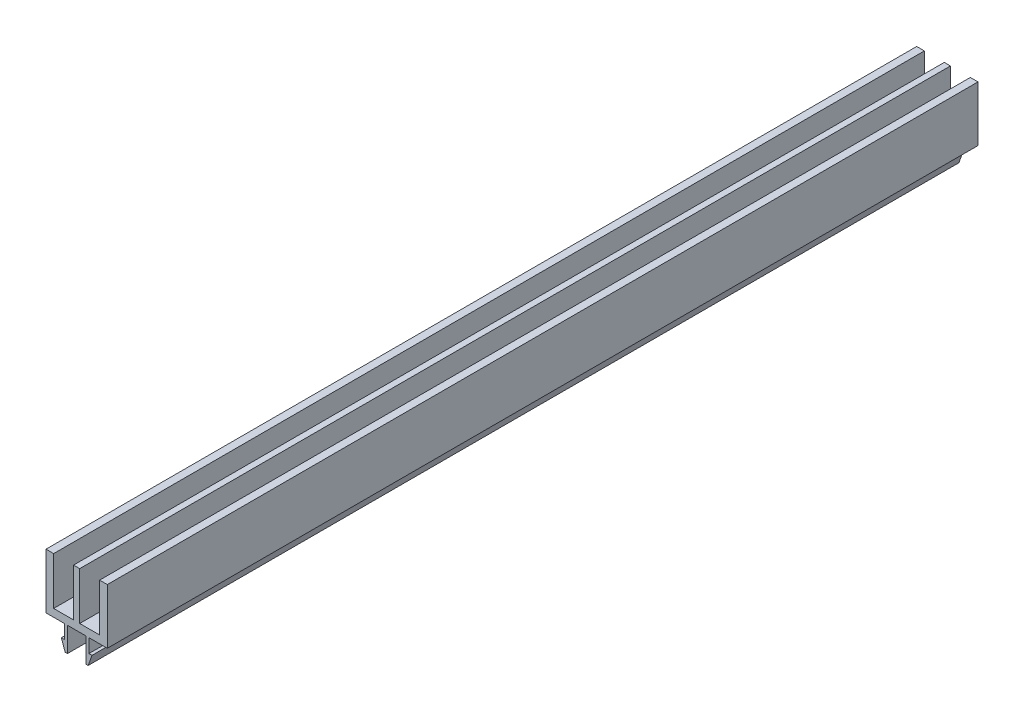
ISO-10303-21;
HEADER;
FILE_DESCRIPTION(('STEP AP214'),'2;1');
FILE_NAME('part.step','',(''),(''),'','','');
FILE_SCHEMA(('AUTOMOTIVE_DESIGN { 1 0 10303 214 1 1 1 1 }'));
ENDSEC;
DATA;
#1=APPLICATION_CONTEXT('core data for automotive mechanical design processes');
#2=APPLICATION_PROTOCOL_DEFINITION('international standard','automotive_design',2000,#1);
#3=PRODUCT_CONTEXT('',#1,'mechanical');
#4=PRODUCT('Part','Part','',(#3));
#5=PRODUCT_RELATED_PRODUCT_CATEGORY('part','',(#4));
#6=PRODUCT_DEFINITION_FORMATION('','',#4);
#7=PRODUCT_DEFINITION_CONTEXT('part definition',#1,'design');
#8=PRODUCT_DEFINITION('design','',#6,#7);
#9=PRODUCT_DEFINITION_SHAPE('','',#8);
#10=(LENGTH_UNIT() NAMED_UNIT(*) SI_UNIT(.MILLI.,.METRE.));
#11=(NAMED_UNIT(*) PLANE_ANGLE_UNIT() SI_UNIT($,.RADIAN.));
#12=(NAMED_UNIT(*) SI_UNIT($,.STERADIAN.) SOLID_ANGLE_UNIT());
#13=UNCERTAINTY_MEASURE_WITH_UNIT(LENGTH_MEASURE(1.E-05),#10,'distance_accuracy_value','');
#14=(GEOMETRIC_REPRESENTATION_CONTEXT(3) GLOBAL_UNCERTAINTY_ASSIGNED_CONTEXT((#13)) GLOBAL_UNIT_ASSIGNED_CONTEXT((#10,
#11,#12)) REPRESENTATION_CONTEXT('',''));
#15=CARTESIAN_POINT('',(0.,0.,0.));
#16=DIRECTION('',(0.,0.,1.));
#17=DIRECTION('',(1.,0.,0.));
#18=AXIS2_PLACEMENT_3D('',#15,#16,#17);
#19=CARTESIAN_POINT('',(-1.,17.9999999975,-234.));
#20=DIRECTION('',(-1.,0.,0.));
#21=DIRECTION('',(0.,-1.,0.));
#22=AXIS2_PLACEMENT_3D('',#19,#20,#21);
#23=PLANE('',#22);
#24=DIRECTION('',(0.,-1.,0.));
#25=VECTOR('',#24,1.);
#26=CARTESIAN_POINT('',(-1.,17.9999999975,50.));
#27=LINE('',#26,#25);
#28=CARTESIAN_POINT('',(-1.,17.9999999975,50.));
#29=VERTEX_POINT('',#28);
#30=CARTESIAN_POINT('',(-1.,2.4999999995,50.));
#31=VERTEX_POINT('',#30);
#32=EDGE_CURVE('E225',#29,#31,#27,.T.);
#33=ORIENTED_EDGE('',*,*,#32,.F.);
#34=DIRECTION('',(0.,0.,1.));
#35=VECTOR('',#34,1.);
#36=CARTESIAN_POINT('',(-1.,17.9999999975,-234.));
#37=LINE('',#36,#35);
#38=CARTESIAN_POINT('',(-1.,17.9999999975,-234.));
#39=VERTEX_POINT('',#38);
#40=EDGE_CURVE('E11',#39,#29,#37,.T.);
#41=ORIENTED_EDGE('',*,*,#40,.F.);
#42=DIRECTION('',(0.,-1.,0.));
#43=VECTOR('',#42,1.);
#44=CARTESIAN_POINT('',(-1.,17.9999999975,-234.));
#45=LINE('',#44,#43);
#46=CARTESIAN_POINT('',(-1.,2.4999999995,-234.));
#47=VERTEX_POINT('',#46);
#48=EDGE_CURVE('E293',#39,#47,#45,.T.);
#49=ORIENTED_EDGE('',*,*,#48,.T.);
#50=DIRECTION('',(0.,0.,1.));
#51=VECTOR('',#50,1.);
#52=CARTESIAN_POINT('',(-1.,2.4999999995,-234.));
#53=LINE('',#52,#51);
#54=EDGE_CURVE('E35',#47,#31,#53,.T.);
#55=ORIENTED_EDGE('',*,*,#54,.T.);
#56=EDGE_LOOP('',(#33,#41,#49,#55));
#57=FACE_BOUND('',#56,.T.);
#58=ADVANCED_FACE('F32',(#57),#23,.T.);
#59=CARTESIAN_POINT('',(0.999999999999998,17.9999999975,-234.));
#60=DIRECTION('',(0.,1.,0.));
#61=DIRECTION('',(0.,0.,1.));
#62=AXIS2_PLACEMENT_3D('',#59,#60,#61);
#63=PLANE('',#62);
#64=DIRECTION('',(-1.,0.,0.));
#65=VECTOR('',#64,1.);
#66=CARTESIAN_POINT('',(0.999999999999998,17.9999999975,50.));
#67=LINE('',#66,#65);
#68=CARTESIAN_POINT('',(0.999999999999998,17.9999999975,50.));
#69=VERTEX_POINT('',#68);
#70=EDGE_CURVE('E291',#69,#29,#67,.T.);
#71=ORIENTED_EDGE('',*,*,#70,.F.);
#72=DIRECTION('',(0.,0.,1.));
#73=VECTOR('',#72,1.);
#74=CARTESIAN_POINT('',(0.999999999999998,17.9999999975,-234.));
#75=LINE('',#74,#73);
#76=CARTESIAN_POINT('',(0.999999999999998,17.9999999975,-234.));
#77=VERTEX_POINT('',#76);
#78=EDGE_CURVE('E41',#77,#69,#75,.T.);
#79=ORIENTED_EDGE('',*,*,#78,.F.);
#80=DIRECTION('',(-1.,0.,0.));
#81=VECTOR('',#80,1.);
#82=CARTESIAN_POINT('',(0.999999999999998,17.9999999975,-234.));
#83=LINE('',#82,#81);
#84=EDGE_CURVE('E215',#77,#39,#83,.T.);
#85=ORIENTED_EDGE('',*,*,#84,.T.);
#86=ORIENTED_EDGE('',*,*,#40,.T.);
#87=EDGE_LOOP('',(#71,#79,#85,#86));
#88=FACE_BOUND('',#87,.T.);
#89=ADVANCED_FACE('F337',(#88),#63,.T.);
#90=CARTESIAN_POINT('',(0.999999999999998,2.4999999995,-234.));
#91=DIRECTION('',(1.,0.,0.));
#92=DIRECTION('',(0.,0.,-1.));
#93=AXIS2_PLACEMENT_3D('',#90,#91,#92);
#94=PLANE('',#93);
#95=DIRECTION('',(0.,1.,0.));
#96=VECTOR('',#95,1.);
#97=CARTESIAN_POINT('',(0.999999999999998,2.4999999995,50.));
#98=LINE('',#97,#96);
#99=CARTESIAN_POINT('',(0.999999999999998,2.4999999995,50.));
#100=VERTEX_POINT('',#99);
#101=EDGE_CURVE('E202',#100,#69,#98,.T.);
#102=ORIENTED_EDGE('',*,*,#101,.F.);
#103=DIRECTION('',(0.,0.,1.));
#104=VECTOR('',#103,1.);
#105=CARTESIAN_POINT('',(0.999999999999998,2.4999999995,-234.));
#106=LINE('',#105,#104);
#107=CARTESIAN_POINT('',(0.999999999999998,2.4999999995,-234.));
#108=VERTEX_POINT('',#107);
#109=EDGE_CURVE('E197',#108,#100,#106,.T.);
#110=ORIENTED_EDGE('',*,*,#109,.F.);
#111=DIRECTION('',(0.,1.,0.));
#112=VECTOR('',#111,1.);
#113=CARTESIAN_POINT('',(0.999999999999998,2.4999999995,-234.));
#114=LINE('',#113,#112);
#115=EDGE_CURVE('E200',#108,#77,#114,.T.);
#116=ORIENTED_EDGE('',*,*,#115,.T.);
#117=ORIENTED_EDGE('',*,*,#78,.T.);
#118=EDGE_LOOP('',(#102,#110,#116,#117));
#119=FACE_BOUND('',#118,.T.);
#120=ADVANCED_FACE('F199',(#119),#94,.T.);
#121=CARTESIAN_POINT('',(7.5,2.4999999995,-234.));
#122=DIRECTION('',(0.,1.,0.));
#123=DIRECTION('',(-1.,0.,0.));
#124=AXIS2_PLACEMENT_3D('',#121,#122,#123);
#125=PLANE('',#124);
#126=DIRECTION('',(-1.,0.,0.));
#127=VECTOR('',#126,1.);
#128=CARTESIAN_POINT('',(7.5,2.4999999995,50.));
#129=LINE('',#128,#127);
#130=CARTESIAN_POINT('',(7.5,2.4999999995,50.));
#131=VERTEX_POINT('',#130);
#132=EDGE_CURVE('E288',#131,#100,#129,.T.);
#133=ORIENTED_EDGE('',*,*,#132,.F.);
#134=DIRECTION('',(0.,0.,1.));
#135=VECTOR('',#134,1.);
#136=CARTESIAN_POINT('',(7.5,2.4999999995,-234.));
#137=LINE('',#136,#135);
#138=CARTESIAN_POINT('',(7.5,2.4999999995,-234.));
#139=VERTEX_POINT('',#138);
#140=EDGE_CURVE('E207',#139,#131,#137,.T.);
#141=ORIENTED_EDGE('',*,*,#140,.F.);
#142=DIRECTION('',(-1.,0.,0.));
#143=VECTOR('',#142,1.);
#144=CARTESIAN_POINT('',(7.5,2.4999999995,-234.));
#145=LINE('',#144,#143);
#146=EDGE_CURVE('E213',#139,#108,#145,.T.);
#147=ORIENTED_EDGE('',*,*,#146,.T.);
#148=ORIENTED_EDGE('',*,*,#109,.T.);
#149=EDGE_LOOP('',(#133,#141,#147,#148));
#150=FACE_BOUND('',#149,.T.);
#151=ADVANCED_FACE('F217',(#150),#125,.T.);
#152=CARTESIAN_POINT('',(7.5,17.9999999975,-234.));
#153=DIRECTION('',(-1.,0.,0.));
#154=DIRECTION('',(0.,-1.,0.));
#155=AXIS2_PLACEMENT_3D('',#152,#153,#154);
#156=PLANE('',#155);
#157=DIRECTION('',(0.,-1.,0.));
#158=VECTOR('',#157,1.);
#159=CARTESIAN_POINT('',(7.5,17.9999999975,50.));
#160=LINE('',#159,#158);
#161=CARTESIAN_POINT('',(7.5,17.9999999975,50.));
#162=VERTEX_POINT('',#161);
#163=EDGE_CURVE('E285',#162,#131,#160,.T.);
#164=ORIENTED_EDGE('',*,*,#163,.F.);
#165=DIRECTION('',(0.,0.,1.));
#166=VECTOR('',#165,1.);
#167=CARTESIAN_POINT('',(7.5,17.9999999975,-234.));
#168=LINE('',#167,#166);
#169=CARTESIAN_POINT('',(7.5,17.9999999975,-234.));
#170=VERTEX_POINT('',#169);
#171=EDGE_CURVE('E297',#170,#162,#168,.T.);
#172=ORIENTED_EDGE('',*,*,#171,.F.);
#173=DIRECTION('',(0.,-1.,0.));
#174=VECTOR('',#173,1.);
#175=CARTESIAN_POINT('',(7.5,17.9999999975,-234.));
#176=LINE('',#175,#174);
#177=EDGE_CURVE('E218',#170,#139,#176,.T.);
#178=ORIENTED_EDGE('',*,*,#177,.T.);
#179=ORIENTED_EDGE('',*,*,#140,.T.);
#180=EDGE_LOOP('',(#164,#172,#178,#179));
#181=FACE_BOUND('',#180,.T.);
#182=ADVANCED_FACE('F350',(#181),#156,.T.);
#183=CARTESIAN_POINT('',(10.,17.9999999975,-234.));
#184=DIRECTION('',(0.,1.,0.));
#185=DIRECTION('',(0.,0.,1.));
#186=AXIS2_PLACEMENT_3D('',#183,#184,#185);
#187=PLANE('',#186);
#188=DIRECTION('',(-1.,0.,0.));
#189=VECTOR('',#188,1.);
#190=CARTESIAN_POINT('',(10.,17.9999999975,50.));
#191=LINE('',#190,#189);
#192=CARTESIAN_POINT('',(10.,17.9999999975,50.));
#193=VERTEX_POINT('',#192);
#194=EDGE_CURVE('E282',#193,#162,#191,.T.);
#195=ORIENTED_EDGE('',*,*,#194,.F.);
#196=DIRECTION('',(0.,0.,1.));
#197=VECTOR('',#196,1.);
#198=CARTESIAN_POINT('',(10.,17.9999999975,-234.));
#199=LINE('',#198,#197);
#200=CARTESIAN_POINT('',(10.,17.9999999975,-234.));
#201=VERTEX_POINT('',#200);
#202=EDGE_CURVE('E299',#201,#193,#199,.T.);
#203=ORIENTED_EDGE('',*,*,#202,.F.);
#204=DIRECTION('',(-1.,0.,0.));
#205=VECTOR('',#204,1.);
#206=CARTESIAN_POINT('',(10.,17.9999999975,-234.));
#207=LINE('',#206,#205);
#208=EDGE_CURVE('E220',#201,#170,#207,.T.);
#209=ORIENTED_EDGE('',*,*,#208,.T.);
#210=ORIENTED_EDGE('',*,*,#171,.T.);
#211=EDGE_LOOP('',(#195,#203,#209,#210));
#212=FACE_BOUND('',#211,.T.);
#213=ADVANCED_FACE('F353',(#212),#187,.T.);
#214=CARTESIAN_POINT('',(10.,-4.99999828349541E-10,-234.));
#215=DIRECTION('',(1.,0.,0.));
#216=DIRECTION('',(0.,0.,-1.));
#217=AXIS2_PLACEMENT_3D('',#214,#215,#216);
#218=PLANE('',#217);
#219=DIRECTION('',(0.,1.,0.));
#220=VECTOR('',#219,1.);
#221=CARTESIAN_POINT('',(10.,-4.99999828349541E-10,50.));
#222=LINE('',#221,#220);
#223=CARTESIAN_POINT('',(10.,-4.99999828349541E-10,50.));
#224=VERTEX_POINT('',#223);
#225=EDGE_CURVE('E279',#224,#193,#222,.T.);
#226=ORIENTED_EDGE('',*,*,#225,.F.);
#227=DIRECTION('',(0.,0.,1.));
#228=VECTOR('',#227,1.);
#229=CARTESIAN_POINT('',(10.,-4.99999828349541E-10,-234.));
#230=LINE('',#229,#228);
#231=CARTESIAN_POINT('',(10.,-4.99999828349541E-10,-234.));
#232=VERTEX_POINT('',#231);
#233=EDGE_CURVE('E301',#232,#224,#230,.T.);
#234=ORIENTED_EDGE('',*,*,#233,.F.);
#235=DIRECTION('',(0.,1.,0.));
#236=VECTOR('',#235,1.);
#237=CARTESIAN_POINT('',(10.,-4.99999828349541E-10,-234.));
#238=LINE('',#237,#236);
#239=EDGE_CURVE('E643',#232,#201,#238,.T.);
#240=ORIENTED_EDGE('',*,*,#239,.T.);
#241=ORIENTED_EDGE('',*,*,#202,.T.);
#242=EDGE_LOOP('',(#226,#234,#240,#241));
#243=FACE_BOUND('',#242,.T.);
#244=ADVANCED_FACE('F357',(#243),#218,.T.);
#245=CARTESIAN_POINT('',(4.,-4.99999998002099E-10,-234.));
#246=DIRECTION('',(0.,-1.,0.));
#247=DIRECTION('',(1.,0.,0.));
#248=AXIS2_PLACEMENT_3D('',#245,#246,#247);
#249=PLANE('',#248);
#250=DIRECTION('',(1.,0.,0.));
#251=VECTOR('',#250,1.);
#252=CARTESIAN_POINT('',(4.,-4.99999998002099E-10,50.));
#253=LINE('',#252,#251);
#254=CARTESIAN_POINT('',(4.,-4.99999998002099E-10,50.));
#255=VERTEX_POINT('',#254);
#256=EDGE_CURVE('E276',#255,#224,#253,.T.);
#257=ORIENTED_EDGE('',*,*,#256,.F.);
#258=DIRECTION('',(0.,0.,1.));
#259=VECTOR('',#258,1.);
#260=CARTESIAN_POINT('',(4.,-4.99999998002099E-10,-234.));
#261=LINE('',#260,#259);
#262=CARTESIAN_POINT('',(4.,-4.99999998002099E-10,-234.));
#263=VERTEX_POINT('',#262);
#264=EDGE_CURVE('E303',#263,#255,#261,.T.);
#265=ORIENTED_EDGE('',*,*,#264,.F.);
#266=DIRECTION('',(1.,0.,0.));
#267=VECTOR('',#266,1.);
#268=CARTESIAN_POINT('',(4.,-4.99999998002099E-10,-234.));
#269=LINE('',#268,#267);
#270=EDGE_CURVE('E647',#263,#232,#269,.T.);
#271=ORIENTED_EDGE('',*,*,#270,.T.);
#272=ORIENTED_EDGE('',*,*,#233,.T.);
#273=EDGE_LOOP('',(#257,#265,#271,#272));
#274=FACE_BOUND('',#273,.T.);
#275=ADVANCED_FACE('F361',(#274),#249,.T.);
#276=CARTESIAN_POINT('',(4.,-4.5,-234.));
#277=DIRECTION('',(1.,0.,0.));
#278=DIRECTION('',(0.,0.,-1.));
#279=AXIS2_PLACEMENT_3D('',#276,#277,#278);
#280=PLANE('',#279);
#281=DIRECTION('',(0.,1.,0.));
#282=VECTOR('',#281,1.);
#283=CARTESIAN_POINT('',(4.,-4.5,50.));
#284=LINE('',#283,#282);
#285=CARTESIAN_POINT('',(4.,-4.5,50.));
#286=VERTEX_POINT('',#285);
#287=EDGE_CURVE('E273',#286,#255,#284,.T.);
#288=ORIENTED_EDGE('',*,*,#287,.F.);
#289=DIRECTION('',(0.,0.,1.));
#290=VECTOR('',#289,1.);
#291=CARTESIAN_POINT('',(4.,-4.5,-234.));
#292=LINE('',#291,#290);
#293=CARTESIAN_POINT('',(4.,-4.5,-234.));
#294=VERTEX_POINT('',#293);
#295=EDGE_CURVE('E305',#294,#286,#292,.T.);
#296=ORIENTED_EDGE('',*,*,#295,.F.);
#297=DIRECTION('',(0.,1.,0.));
#298=VECTOR('',#297,1.);
#299=CARTESIAN_POINT('',(4.,-4.5,-234.));
#300=LINE('',#299,#298);
#301=EDGE_CURVE('E636',#294,#263,#300,.T.);
#302=ORIENTED_EDGE('',*,*,#301,.T.);
#303=ORIENTED_EDGE('',*,*,#264,.T.);
#304=EDGE_LOOP('',(#288,#296,#302,#303));
#305=FACE_BOUND('',#304,.T.);
#306=ADVANCED_FACE('F365',(#305),#280,.T.);
#307=CARTESIAN_POINT('',(5.,-4.5,-234.));
#308=DIRECTION('',(0.,1.,0.));
#309=DIRECTION('',(0.,0.,1.));
#310=AXIS2_PLACEMENT_3D('',#307,#308,#309);
#311=PLANE('',#310);
#312=DIRECTION('',(-1.,0.,0.));
#313=VECTOR('',#312,1.);
#314=CARTESIAN_POINT('',(5.,-4.5,50.));
#315=LINE('',#314,#313);
#316=CARTESIAN_POINT('',(5.,-4.5,50.));
#317=VERTEX_POINT('',#316);
#318=EDGE_CURVE('E270',#317,#286,#315,.T.);
#319=ORIENTED_EDGE('',*,*,#318,.F.);
#320=DIRECTION('',(0.,0.,1.));
#321=VECTOR('',#320,1.);
#322=CARTESIAN_POINT('',(5.,-4.5,-234.));
#323=LINE('',#322,#321);
#324=CARTESIAN_POINT('',(5.,-4.5,-234.));
#325=VERTEX_POINT('',#324);
#326=EDGE_CURVE('E307',#325,#317,#323,.T.);
#327=ORIENTED_EDGE('',*,*,#326,.F.);
#328=DIRECTION('',(-1.,0.,0.));
#329=VECTOR('',#328,1.);
#330=CARTESIAN_POINT('',(5.,-4.5,-234.));
#331=LINE('',#330,#329);
#332=EDGE_CURVE('E632',#325,#294,#331,.T.);
#333=ORIENTED_EDGE('',*,*,#332,.T.);
#334=ORIENTED_EDGE('',*,*,#295,.T.);
#335=EDGE_LOOP('',(#319,#327,#333,#334));
#336=FACE_BOUND('',#335,.T.);
#337=ADVANCED_FACE('F369',(#336),#311,.T.);
#338=CARTESIAN_POINT('',(3.75,-8.,-234.));
#339=DIRECTION('',(0.941741911594837,-0.336336396998156,0.));
#340=DIRECTION('',(0.336336396998157,0.941741911594838,0.));
#341=AXIS2_PLACEMENT_3D('',#338,#339,#340);
#342=PLANE('',#341);
#343=DIRECTION('',(0.336336396998157,0.941741911594837,0.));
#344=VECTOR('',#343,1.);
#345=CARTESIAN_POINT('',(3.75,-8.,50.));
#346=LINE('',#345,#344);
#347=CARTESIAN_POINT('',(3.75,-8.,50.));
#348=VERTEX_POINT('',#347);
#349=EDGE_CURVE('E267',#348,#317,#346,.T.);
#350=ORIENTED_EDGE('',*,*,#349,.F.);
#351=DIRECTION('',(0.,0.,1.));
#352=VECTOR('',#351,1.);
#353=CARTESIAN_POINT('',(3.75,-8.,-234.));
#354=LINE('',#353,#352);
#355=CARTESIAN_POINT('',(3.75,-8.,-234.));
#356=VERTEX_POINT('',#355);
#357=EDGE_CURVE('E309',#356,#348,#354,.T.);
#358=ORIENTED_EDGE('',*,*,#357,.F.);
#359=DIRECTION('',(0.336336396998157,0.941741911594837,0.));
#360=VECTOR('',#359,1.);
#361=CARTESIAN_POINT('',(3.75,-8.,-234.));
#362=LINE('',#361,#360);
#363=EDGE_CURVE('E653',#356,#325,#362,.T.);
#364=ORIENTED_EDGE('',*,*,#363,.T.);
#365=ORIENTED_EDGE('',*,*,#326,.T.);
#366=EDGE_LOOP('',(#350,#358,#364,#365));
#367=FACE_BOUND('',#366,.T.);
#368=ADVANCED_FACE('F373',(#367),#342,.T.);
#369=CARTESIAN_POINT('',(3.,-8.,-234.));
#370=DIRECTION('',(0.,-1.,0.));
#371=DIRECTION('',(0.,0.,-1.));
#372=AXIS2_PLACEMENT_3D('',#369,#370,#371);
#373=PLANE('',#372);
#374=DIRECTION('',(1.,0.,0.));
#375=VECTOR('',#374,1.);
#376=CARTESIAN_POINT('',(3.,-8.,50.));
#377=LINE('',#376,#375);
#378=CARTESIAN_POINT('',(3.,-8.,50.));
#379=VERTEX_POINT('',#378);
#380=EDGE_CURVE('E264',#379,#348,#377,.T.);
#381=ORIENTED_EDGE('',*,*,#380,.F.);
#382=DIRECTION('',(0.,0.,1.));
#383=VECTOR('',#382,1.);
#384=CARTESIAN_POINT('',(3.,-8.,-234.));
#385=LINE('',#384,#383);
#386=CARTESIAN_POINT('',(3.,-8.,-234.));
#387=VERTEX_POINT('',#386);
#388=EDGE_CURVE('E311',#387,#379,#385,.T.);
#389=ORIENTED_EDGE('',*,*,#388,.F.);
#390=DIRECTION('',(1.,0.,0.));
#391=VECTOR('',#390,1.);
#392=CARTESIAN_POINT('',(3.,-8.,-234.));
#393=LINE('',#392,#391);
#394=EDGE_CURVE('E625',#387,#356,#393,.T.);
#395=ORIENTED_EDGE('',*,*,#394,.T.);
#396=ORIENTED_EDGE('',*,*,#357,.T.);
#397=EDGE_LOOP('',(#381,#389,#395,#396));
#398=FACE_BOUND('',#397,.T.);
#399=ADVANCED_FACE('F377',(#398),#373,.T.);
#400=CARTESIAN_POINT('',(3.,-4.9999985194348E-10,-234.));
#401=DIRECTION('',(-1.,0.,0.));
#402=DIRECTION('',(0.,0.,1.));
#403=AXIS2_PLACEMENT_3D('',#400,#401,#402);
#404=PLANE('',#403);
#405=DIRECTION('',(0.,-1.,0.));
#406=VECTOR('',#405,1.);
#407=CARTESIAN_POINT('',(3.,-4.9999985194348E-10,50.));
#408=LINE('',#407,#406);
#409=CARTESIAN_POINT('',(3.,-4.9999985194348E-10,50.));
#410=VERTEX_POINT('',#409);
#411=EDGE_CURVE('E261',#410,#379,#408,.T.);
#412=ORIENTED_EDGE('',*,*,#411,.F.);
#413=DIRECTION('',(0.,0.,1.));
#414=VECTOR('',#413,1.);
#415=CARTESIAN_POINT('',(3.,-4.9999985194348E-10,-234.));
#416=LINE('',#415,#414);
#417=CARTESIAN_POINT('',(3.,-4.9999985194348E-10,-234.));
#418=VERTEX_POINT('',#417);
#419=EDGE_CURVE('E313',#418,#410,#416,.T.);
#420=ORIENTED_EDGE('',*,*,#419,.F.);
#421=DIRECTION('',(0.,-1.,0.));
#422=VECTOR('',#421,1.);
#423=CARTESIAN_POINT('',(3.,-4.9999985194348E-10,-234.));
#424=LINE('',#423,#422);
#425=EDGE_CURVE('E621',#418,#387,#424,.T.);
#426=ORIENTED_EDGE('',*,*,#425,.T.);
#427=ORIENTED_EDGE('',*,*,#388,.T.);
#428=EDGE_LOOP('',(#412,#420,#426,#427));
#429=FACE_BOUND('',#428,.T.);
#430=ADVANCED_FACE('F381',(#429),#404,.T.);
#431=CARTESIAN_POINT('',(-3.,-4.99999455901012E-10,-234.));
#432=DIRECTION('',(0.,-1.,0.));
#433=DIRECTION('',(1.,0.,0.));
#434=AXIS2_PLACEMENT_3D('',#431,#432,#433);
#435=PLANE('',#434);
#436=DIRECTION('',(1.,0.,0.));
#437=VECTOR('',#436,1.);
#438=CARTESIAN_POINT('',(-3.,-4.99999455901012E-10,50.));
#439=LINE('',#438,#437);
#440=CARTESIAN_POINT('',(-3.,-4.99999455901012E-10,50.));
#441=VERTEX_POINT('',#440);
#442=EDGE_CURVE('E258',#441,#410,#439,.T.);
#443=ORIENTED_EDGE('',*,*,#442,.F.);
#444=DIRECTION('',(0.,0.,1.));
#445=VECTOR('',#444,1.);
#446=CARTESIAN_POINT('',(-3.,-4.99999455901012E-10,-234.));
#447=LINE('',#446,#445);
#448=CARTESIAN_POINT('',(-3.,-4.99999455901012E-10,-234.));
#449=VERTEX_POINT('',#448);
#450=EDGE_CURVE('E315',#449,#441,#447,.T.);
#451=ORIENTED_EDGE('',*,*,#450,.F.);
#452=DIRECTION('',(1.,0.,0.));
#453=VECTOR('',#452,1.);
#454=CARTESIAN_POINT('',(-3.,-4.99999455901012E-10,-234.));
#455=LINE('',#454,#453);
#456=EDGE_CURVE('E657',#449,#418,#455,.T.);
#457=ORIENTED_EDGE('',*,*,#456,.T.);
#458=ORIENTED_EDGE('',*,*,#419,.T.);
#459=EDGE_LOOP('',(#443,#451,#457,#458));
#460=FACE_BOUND('',#459,.T.);
#461=ADVANCED_FACE('F385',(#460),#435,.T.);
#462=CARTESIAN_POINT('',(-3.,-8.,-234.));
#463=DIRECTION('',(1.,0.,0.));
#464=DIRECTION('',(0.,0.,-1.));
#465=AXIS2_PLACEMENT_3D('',#462,#463,#464);
#466=PLANE('',#465);
#467=DIRECTION('',(0.,1.,0.));
#468=VECTOR('',#467,1.);
#469=CARTESIAN_POINT('',(-3.,-8.,50.));
#470=LINE('',#469,#468);
#471=CARTESIAN_POINT('',(-3.,-8.,50.));
#472=VERTEX_POINT('',#471);
#473=EDGE_CURVE('E255',#472,#441,#470,.T.);
#474=ORIENTED_EDGE('',*,*,#473,.F.);
#475=DIRECTION('',(0.,0.,1.));
#476=VECTOR('',#475,1.);
#477=CARTESIAN_POINT('',(-3.,-8.,-234.));
#478=LINE('',#477,#476);
#479=CARTESIAN_POINT('',(-3.,-8.,-234.));
#480=VERTEX_POINT('',#479);
#481=EDGE_CURVE('E317',#480,#472,#478,.T.);
#482=ORIENTED_EDGE('',*,*,#481,.F.);
#483=DIRECTION('',(0.,1.,0.));
#484=VECTOR('',#483,1.);
#485=CARTESIAN_POINT('',(-3.,-8.,-234.));
#486=LINE('',#485,#484);
#487=EDGE_CURVE('E614',#480,#449,#486,.T.);
#488=ORIENTED_EDGE('',*,*,#487,.T.);
#489=ORIENTED_EDGE('',*,*,#450,.T.);
#490=EDGE_LOOP('',(#474,#482,#488,#489));
#491=FACE_BOUND('',#490,.T.);
#492=ADVANCED_FACE('F389',(#491),#466,.T.);
#493=CARTESIAN_POINT('',(-3.75,-8.,-234.));
#494=DIRECTION('',(0.,-1.,0.));
#495=DIRECTION('',(0.,0.,-1.));
#496=AXIS2_PLACEMENT_3D('',#493,#494,#495);
#497=PLANE('',#496);
#498=DIRECTION('',(1.,0.,0.));
#499=VECTOR('',#498,1.);
#500=CARTESIAN_POINT('',(-3.75,-8.,50.));
#501=LINE('',#500,#499);
#502=CARTESIAN_POINT('',(-3.75,-8.,50.));
#503=VERTEX_POINT('',#502);
#504=EDGE_CURVE('E252',#503,#472,#501,.T.);
#505=ORIENTED_EDGE('',*,*,#504,.F.);
#506=DIRECTION('',(0.,0.,1.));
#507=VECTOR('',#506,1.);
#508=CARTESIAN_POINT('',(-3.75,-8.,-234.));
#509=LINE('',#508,#507);
#510=CARTESIAN_POINT('',(-3.75,-8.,-234.));
#511=VERTEX_POINT('',#510);
#512=EDGE_CURVE('E319',#511,#503,#509,.T.);
#513=ORIENTED_EDGE('',*,*,#512,.F.);
#514=DIRECTION('',(1.,0.,0.));
#515=VECTOR('',#514,1.);
#516=CARTESIAN_POINT('',(-3.75,-8.,-234.));
#517=LINE('',#516,#515);
#518=EDGE_CURVE('E610',#511,#480,#517,.T.);
#519=ORIENTED_EDGE('',*,*,#518,.T.);
#520=ORIENTED_EDGE('',*,*,#481,.T.);
#521=EDGE_LOOP('',(#505,#513,#519,#520));
#522=FACE_BOUND('',#521,.T.);
#523=ADVANCED_FACE('F393',(#522),#497,.T.);
#524=CARTESIAN_POINT('',(-5.,-4.5,-234.));
#525=DIRECTION('',(-0.941741911594838,-0.336336396998156,0.));
#526=DIRECTION('',(0.336336396998156,-0.941741911594838,0.));
#527=AXIS2_PLACEMENT_3D('',#524,#525,#526);
#528=PLANE('',#527);
#529=DIRECTION('',(0.336336396998156,-0.941741911594837,0.));
#530=VECTOR('',#529,1.);
#531=CARTESIAN_POINT('',(-5.,-4.5,50.));
#532=LINE('',#531,#530);
#533=CARTESIAN_POINT('',(-5.,-4.5,50.));
#534=VERTEX_POINT('',#533);
#535=EDGE_CURVE('E249',#534,#503,#532,.T.);
#536=ORIENTED_EDGE('',*,*,#535,.F.);
#537=DIRECTION('',(0.,0.,1.));
#538=VECTOR('',#537,1.);
#539=CARTESIAN_POINT('',(-5.,-4.5,-234.));
#540=LINE('',#539,#538);
#541=CARTESIAN_POINT('',(-5.,-4.5,-234.));
#542=VERTEX_POINT('',#541);
#543=EDGE_CURVE('E321',#542,#534,#540,.T.);
#544=ORIENTED_EDGE('',*,*,#543,.F.);
#545=DIRECTION('',(0.336336396998156,-0.941741911594837,0.));
#546=VECTOR('',#545,1.);
#547=CARTESIAN_POINT('',(-5.,-4.5,-234.));
#548=LINE('',#547,#546);
#549=EDGE_CURVE('E661',#542,#511,#548,.T.);
#550=ORIENTED_EDGE('',*,*,#549,.T.);
#551=ORIENTED_EDGE('',*,*,#512,.T.);
#552=EDGE_LOOP('',(#536,#544,#550,#551));
#553=FACE_BOUND('',#552,.T.);
#554=ADVANCED_FACE('F397',(#553),#528,.T.);
#555=CARTESIAN_POINT('',(-4.,-4.5,-234.));
#556=DIRECTION('',(0.,1.,0.));
#557=DIRECTION('',(0.,0.,1.));
#558=AXIS2_PLACEMENT_3D('',#555,#556,#557);
#559=PLANE('',#558);
#560=DIRECTION('',(-1.,0.,0.));
#561=VECTOR('',#560,1.);
#562=CARTESIAN_POINT('',(-4.,-4.5,50.));
#563=LINE('',#562,#561);
#564=CARTESIAN_POINT('',(-4.,-4.5,50.));
#565=VERTEX_POINT('',#564);
#566=EDGE_CURVE('E246',#565,#534,#563,.T.);
#567=ORIENTED_EDGE('',*,*,#566,.F.);
#568=DIRECTION('',(0.,0.,1.));
#569=VECTOR('',#568,1.);
#570=CARTESIAN_POINT('',(-4.,-4.5,-234.));
#571=LINE('',#570,#569);
#572=CARTESIAN_POINT('',(-4.,-4.5,-234.));
#573=VERTEX_POINT('',#572);
#574=EDGE_CURVE('E323',#573,#565,#571,.T.);
#575=ORIENTED_EDGE('',*,*,#574,.F.);
#576=DIRECTION('',(-1.,0.,0.));
#577=VECTOR('',#576,1.);
#578=CARTESIAN_POINT('',(-4.,-4.5,-234.));
#579=LINE('',#578,#577);
#580=EDGE_CURVE('E603',#573,#542,#579,.T.);
#581=ORIENTED_EDGE('',*,*,#580,.T.);
#582=ORIENTED_EDGE('',*,*,#543,.T.);
#583=EDGE_LOOP('',(#567,#575,#581,#582));
#584=FACE_BOUND('',#583,.T.);
#585=ADVANCED_FACE('F401',(#584),#559,.T.);
#586=CARTESIAN_POINT('',(-4.,-4.9999985194348E-10,-234.));
#587=DIRECTION('',(-1.,0.,0.));
#588=DIRECTION('',(0.,0.,1.));
#589=AXIS2_PLACEMENT_3D('',#586,#587,#588);
#590=PLANE('',#589);
#591=DIRECTION('',(0.,-1.,0.));
#592=VECTOR('',#591,1.);
#593=CARTESIAN_POINT('',(-4.,-4.9999985194348E-10,50.));
#594=LINE('',#593,#592);
#595=CARTESIAN_POINT('',(-4.,-4.9999985194348E-10,50.));
#596=VERTEX_POINT('',#595);
#597=EDGE_CURVE('E243',#596,#565,#594,.T.);
#598=ORIENTED_EDGE('',*,*,#597,.F.);
#599=DIRECTION('',(0.,0.,1.));
#600=VECTOR('',#599,1.);
#601=CARTESIAN_POINT('',(-4.,-4.9999985194348E-10,-234.));
#602=LINE('',#601,#600);
#603=CARTESIAN_POINT('',(-4.,-4.9999985194348E-10,-234.));
#604=VERTEX_POINT('',#603);
#605=EDGE_CURVE('E325',#604,#596,#602,.T.);
#606=ORIENTED_EDGE('',*,*,#605,.F.);
#607=DIRECTION('',(0.,-1.,0.));
#608=VECTOR('',#607,1.);
#609=CARTESIAN_POINT('',(-4.,-4.9999985194348E-10,-234.));
#610=LINE('',#609,#608);
#611=EDGE_CURVE('E599',#604,#573,#610,.T.);
#612=ORIENTED_EDGE('',*,*,#611,.T.);
#613=ORIENTED_EDGE('',*,*,#574,.T.);
#614=EDGE_LOOP('',(#598,#606,#612,#613));
#615=FACE_BOUND('',#614,.T.);
#616=ADVANCED_FACE('F405',(#615),#590,.T.);
#617=CARTESIAN_POINT('',(-10.,-4.99999719929324E-10,-234.));
#618=DIRECTION('',(0.,-1.,0.));
#619=DIRECTION('',(1.,0.,0.));
#620=AXIS2_PLACEMENT_3D('',#617,#618,#619);
#621=PLANE('',#620);
#622=DIRECTION('',(1.,0.,0.));
#623=VECTOR('',#622,1.);
#624=CARTESIAN_POINT('',(-10.,-4.99999719929324E-10,50.));
#625=LINE('',#624,#623);
#626=CARTESIAN_POINT('',(-10.,-4.99999719929324E-10,50.));
#627=VERTEX_POINT('',#626);
#628=EDGE_CURVE('E240',#627,#596,#625,.T.);
#629=ORIENTED_EDGE('',*,*,#628,.F.);
#630=DIRECTION('',(0.,0.,1.));
#631=VECTOR('',#630,1.);
#632=CARTESIAN_POINT('',(-10.,-4.99999719929324E-10,-234.));
#633=LINE('',#632,#631);
#634=CARTESIAN_POINT('',(-10.,-4.99999719929324E-10,-234.));
#635=VERTEX_POINT('',#634);
#636=EDGE_CURVE('E327',#635,#627,#633,.T.);
#637=ORIENTED_EDGE('',*,*,#636,.F.);
#638=DIRECTION('',(1.,0.,0.));
#639=VECTOR('',#638,1.);
#640=CARTESIAN_POINT('',(-10.,-4.99999719929324E-10,-234.));
#641=LINE('',#640,#639);
#642=EDGE_CURVE('E665',#635,#604,#641,.T.);
#643=ORIENTED_EDGE('',*,*,#642,.T.);
#644=ORIENTED_EDGE('',*,*,#605,.T.);
#645=EDGE_LOOP('',(#629,#637,#643,#644));
#646=FACE_BOUND('',#645,.T.);
#647=ADVANCED_FACE('F409',(#646),#621,.T.);
#648=CARTESIAN_POINT('',(-10.,17.9999999975,-234.));
#649=DIRECTION('',(-1.,0.,0.));
#650=DIRECTION('',(0.,-1.,0.));
#651=AXIS2_PLACEMENT_3D('',#648,#649,#650);
#652=PLANE('',#651);
#653=DIRECTION('',(0.,-1.,0.));
#654=VECTOR('',#653,1.);
#655=CARTESIAN_POINT('',(-10.,17.9999999975,50.));
#656=LINE('',#655,#654);
#657=CARTESIAN_POINT('',(-10.,17.9999999975,50.));
#658=VERTEX_POINT('',#657);
#659=EDGE_CURVE('E237',#658,#627,#656,.T.);
#660=ORIENTED_EDGE('',*,*,#659,.F.);
#661=DIRECTION('',(0.,0.,1.));
#662=VECTOR('',#661,1.);
#663=CARTESIAN_POINT('',(-10.,17.9999999975,-234.));
#664=LINE('',#663,#662);
#665=CARTESIAN_POINT('',(-10.,17.9999999975,-234.));
#666=VERTEX_POINT('',#665);
#667=EDGE_CURVE('E329',#666,#658,#664,.T.);
#668=ORIENTED_EDGE('',*,*,#667,.F.);
#669=DIRECTION('',(0.,-1.,0.));
#670=VECTOR('',#669,1.);
#671=CARTESIAN_POINT('',(-10.,17.9999999975,-234.));
#672=LINE('',#671,#670);
#673=EDGE_CURVE('E592',#666,#635,#672,.T.);
#674=ORIENTED_EDGE('',*,*,#673,.T.);
#675=ORIENTED_EDGE('',*,*,#636,.T.);
#676=EDGE_LOOP('',(#660,#668,#674,#675));
#677=FACE_BOUND('',#676,.T.);
#678=ADVANCED_FACE('F413',(#677),#652,.T.);
#679=CARTESIAN_POINT('',(-7.5,17.9999999975,-234.));
#680=DIRECTION('',(0.,1.,0.));
#681=DIRECTION('',(0.,0.,1.));
#682=AXIS2_PLACEMENT_3D('',#679,#680,#681);
#683=PLANE('',#682);
#684=DIRECTION('',(-1.,0.,0.));
#685=VECTOR('',#684,1.);
#686=CARTESIAN_POINT('',(-7.5,17.9999999975,50.));
#687=LINE('',#686,#685);
#688=CARTESIAN_POINT('',(-7.5,17.9999999975,50.));
#689=VERTEX_POINT('',#688);
#690=EDGE_CURVE('E234',#689,#658,#687,.T.);
#691=ORIENTED_EDGE('',*,*,#690,.F.);
#692=DIRECTION('',(0.,0.,1.));
#693=VECTOR('',#692,1.);
#694=CARTESIAN_POINT('',(-7.5,17.9999999975,-234.));
#695=LINE('',#694,#693);
#696=CARTESIAN_POINT('',(-7.5,17.9999999975,-234.));
#697=VERTEX_POINT('',#696);
#698=EDGE_CURVE('E331',#697,#689,#695,.T.);
#699=ORIENTED_EDGE('',*,*,#698,.F.);
#700=DIRECTION('',(-1.,0.,0.));
#701=VECTOR('',#700,1.);
#702=CARTESIAN_POINT('',(-7.5,17.9999999975,-234.));
#703=LINE('',#702,#701);
#704=EDGE_CURVE('E588',#697,#666,#703,.T.);
#705=ORIENTED_EDGE('',*,*,#704,.T.);
#706=ORIENTED_EDGE('',*,*,#667,.T.);
#707=EDGE_LOOP('',(#691,#699,#705,#706));
#708=FACE_BOUND('',#707,.T.);
#709=ADVANCED_FACE('F417',(#708),#683,.T.);
#710=CARTESIAN_POINT('',(-7.5,2.4999999995,-234.));
#711=DIRECTION('',(1.,0.,0.));
#712=DIRECTION('',(0.,0.,-1.));
#713=AXIS2_PLACEMENT_3D('',#710,#711,#712);
#714=PLANE('',#713);
#715=DIRECTION('',(0.,1.,0.));
#716=VECTOR('',#715,1.);
#717=CARTESIAN_POINT('',(-7.5,2.4999999995,50.));
#718=LINE('',#717,#716);
#719=CARTESIAN_POINT('',(-7.5,2.4999999995,50.));
#720=VERTEX_POINT('',#719);
#721=EDGE_CURVE('E231',#720,#689,#718,.T.);
#722=ORIENTED_EDGE('',*,*,#721,.F.);
#723=DIRECTION('',(0.,0.,1.));
#724=VECTOR('',#723,1.);
#725=CARTESIAN_POINT('',(-7.5,2.4999999995,-234.));
#726=LINE('',#725,#724);
#727=CARTESIAN_POINT('',(-7.5,2.4999999995,-234.));
#728=VERTEX_POINT('',#727);
#729=EDGE_CURVE('E332',#728,#720,#726,.T.);
#730=ORIENTED_EDGE('',*,*,#729,.F.);
#731=DIRECTION('',(0.,1.,0.));
#732=VECTOR('',#731,1.);
#733=CARTESIAN_POINT('',(-7.5,2.4999999995,-234.));
#734=LINE('',#733,#732);
#735=EDGE_CURVE('E669',#728,#697,#734,.T.);
#736=ORIENTED_EDGE('',*,*,#735,.T.);
#737=ORIENTED_EDGE('',*,*,#698,.T.);
#738=EDGE_LOOP('',(#722,#730,#736,#737));
#739=FACE_BOUND('',#738,.T.);
#740=ADVANCED_FACE('F421',(#739),#714,.T.);
#741=CARTESIAN_POINT('',(-1.,2.4999999995,-234.));
#742=DIRECTION('',(0.,1.,0.));
#743=DIRECTION('',(-1.,0.,0.));
#744=AXIS2_PLACEMENT_3D('',#741,#742,#743);
#745=PLANE('',#744);
#746=DIRECTION('',(-1.,0.,0.));
#747=VECTOR('',#746,1.);
#748=CARTESIAN_POINT('',(-1.,2.4999999995,50.));
#749=LINE('',#748,#747);
#750=EDGE_CURVE('E228',#31,#720,#749,.T.);
#751=ORIENTED_EDGE('',*,*,#750,.F.);
#752=ORIENTED_EDGE('',*,*,#54,.F.);
#753=DIRECTION('',(-1.,0.,0.));
#754=VECTOR('',#753,1.);
#755=CARTESIAN_POINT('',(-1.,2.4999999995,-234.));
#756=LINE('',#755,#754);
#757=EDGE_CURVE('E671',#47,#728,#756,.T.);
#758=ORIENTED_EDGE('',*,*,#757,.T.);
#759=ORIENTED_EDGE('',*,*,#729,.T.);
#760=EDGE_LOOP('',(#751,#752,#758,#759));
#761=FACE_BOUND('',#760,.T.);
#762=ADVANCED_FACE('F334',(#761),#745,.T.);
#763=CARTESIAN_POINT('',(0.,0.,-234.));
#764=DIRECTION('',(0.,0.,-1.));
#765=DIRECTION('',(-1.,0.,0.));
#766=AXIS2_PLACEMENT_3D('',#763,#764,#765);
#767=PLANE('',#766);
#768=ORIENTED_EDGE('',*,*,#48,.F.);
#769=ORIENTED_EDGE('',*,*,#84,.F.);
#770=ORIENTED_EDGE('',*,*,#115,.F.);
#771=ORIENTED_EDGE('',*,*,#146,.F.);
#772=ORIENTED_EDGE('',*,*,#177,.F.);
#773=ORIENTED_EDGE('',*,*,#208,.F.);
#774=ORIENTED_EDGE('',*,*,#239,.F.);
#775=ORIENTED_EDGE('',*,*,#270,.F.);
#776=ORIENTED_EDGE('',*,*,#301,.F.);
#777=ORIENTED_EDGE('',*,*,#332,.F.);
#778=ORIENTED_EDGE('',*,*,#363,.F.);
#779=ORIENTED_EDGE('',*,*,#394,.F.);
#780=ORIENTED_EDGE('',*,*,#425,.F.);
#781=ORIENTED_EDGE('',*,*,#456,.F.);
#782=ORIENTED_EDGE('',*,*,#487,.F.);
#783=ORIENTED_EDGE('',*,*,#518,.F.);
#784=ORIENTED_EDGE('',*,*,#549,.F.);
#785=ORIENTED_EDGE('',*,*,#580,.F.);
#786=ORIENTED_EDGE('',*,*,#611,.F.);
#787=ORIENTED_EDGE('',*,*,#642,.F.);
#788=ORIENTED_EDGE('',*,*,#673,.F.);
#789=ORIENTED_EDGE('',*,*,#704,.F.);
#790=ORIENTED_EDGE('',*,*,#735,.F.);
#791=ORIENTED_EDGE('',*,*,#757,.F.);
#792=EDGE_LOOP('',(#768,#769,#770,#771,#772,#773,#774,#775,#776,#777,#778,#779,#780,#781,#782,
#783,#784,#785,#786,#787,#788,#789,#790,#791));
#793=FACE_BOUND('',#792,.T.);
#794=ADVANCED_FACE('F211',(#793),#767,.T.);
#795=CARTESIAN_POINT('',(0.,0.,50.));
#796=DIRECTION('',(0.,0.,-1.));
#797=DIRECTION('',(-1.,0.,0.));
#798=AXIS2_PLACEMENT_3D('',#795,#796,#797);
#799=PLANE('',#798);
#800=ORIENTED_EDGE('',*,*,#32,.T.);
#801=ORIENTED_EDGE('',*,*,#750,.T.);
#802=ORIENTED_EDGE('',*,*,#721,.T.);
#803=ORIENTED_EDGE('',*,*,#690,.T.);
#804=ORIENTED_EDGE('',*,*,#659,.T.);
#805=ORIENTED_EDGE('',*,*,#628,.T.);
#806=ORIENTED_EDGE('',*,*,#597,.T.);
#807=ORIENTED_EDGE('',*,*,#566,.T.);
#808=ORIENTED_EDGE('',*,*,#535,.T.);
#809=ORIENTED_EDGE('',*,*,#504,.T.);
#810=ORIENTED_EDGE('',*,*,#473,.T.);
#811=ORIENTED_EDGE('',*,*,#442,.T.);
#812=ORIENTED_EDGE('',*,*,#411,.T.);
#813=ORIENTED_EDGE('',*,*,#380,.T.);
#814=ORIENTED_EDGE('',*,*,#349,.T.);
#815=ORIENTED_EDGE('',*,*,#318,.T.);
#816=ORIENTED_EDGE('',*,*,#287,.T.);
#817=ORIENTED_EDGE('',*,*,#256,.T.);
#818=ORIENTED_EDGE('',*,*,#225,.T.);
#819=ORIENTED_EDGE('',*,*,#194,.T.);
#820=ORIENTED_EDGE('',*,*,#163,.T.);
#821=ORIENTED_EDGE('',*,*,#132,.T.);
#822=ORIENTED_EDGE('',*,*,#101,.T.);
#823=ORIENTED_EDGE('',*,*,#70,.T.);
#824=EDGE_LOOP('',(#800,#801,#802,#803,#804,#805,#806,#807,#808,#809,#810,#811,#812,#813,#814,
#815,#816,#817,#818,#819,#820,#821,#822,#823));
#825=FACE_BOUND('',#824,.T.);
#826=ADVANCED_FACE('F336',(#825),#799,.F.);
#827=CLOSED_SHELL('',(#58,#89,#120,#151,#182,#213,#244,#275,#306,#337,#368,#399,#430,#461,#492,
#523,#554,#585,#616,#647,#678,#709,#740,#762,#794,#826));
#828=MANIFOLD_SOLID_BREP('B2',#827);
#829=ADVANCED_BREP_SHAPE_REPRESENTATION('',(#18,#828),#14);
#830=SHAPE_DEFINITION_REPRESENTATION(#9,#829);
ENDSEC;
END-ISO-10303-21;
